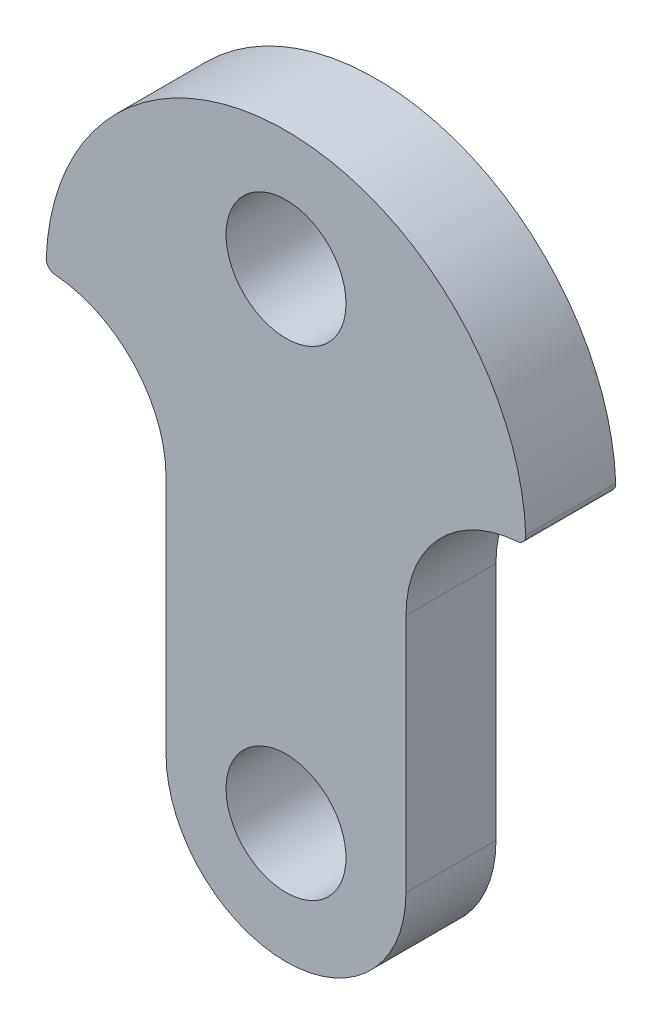
ISO-10303-21;
HEADER;
FILE_DESCRIPTION(('STEP AP214'),'2;1');
FILE_NAME('part.step','',(''),(''),'','','');
FILE_SCHEMA(('AUTOMOTIVE_DESIGN { 1 0 10303 214 1 1 1 1 }'));
ENDSEC;
DATA;
#1=APPLICATION_CONTEXT('core data for automotive mechanical design processes');
#2=APPLICATION_PROTOCOL_DEFINITION('international standard','automotive_design',2000,#1);
#3=PRODUCT_CONTEXT('',#1,'mechanical');
#4=PRODUCT('Part','Part','',(#3));
#5=PRODUCT_RELATED_PRODUCT_CATEGORY('part','',(#4));
#6=PRODUCT_DEFINITION_FORMATION('','',#4);
#7=PRODUCT_DEFINITION_CONTEXT('part definition',#1,'design');
#8=PRODUCT_DEFINITION('design','',#6,#7);
#9=PRODUCT_DEFINITION_SHAPE('','',#8);
#10=(LENGTH_UNIT() NAMED_UNIT(*) SI_UNIT(.MILLI.,.METRE.));
#11=(NAMED_UNIT(*) PLANE_ANGLE_UNIT() SI_UNIT($,.RADIAN.));
#12=(NAMED_UNIT(*) SI_UNIT($,.STERADIAN.) SOLID_ANGLE_UNIT());
#13=UNCERTAINTY_MEASURE_WITH_UNIT(LENGTH_MEASURE(1.E-05),#10,'distance_accuracy_value','');
#14=(GEOMETRIC_REPRESENTATION_CONTEXT(3) GLOBAL_UNCERTAINTY_ASSIGNED_CONTEXT((#13)) GLOBAL_UNIT_ASSIGNED_CONTEXT((#10,
#11,#12)) REPRESENTATION_CONTEXT('',''));
#15=CARTESIAN_POINT('',(0.,0.,0.));
#16=DIRECTION('',(0.,0.,1.));
#17=DIRECTION('',(1.,0.,0.));
#18=AXIS2_PLACEMENT_3D('',#15,#16,#17);
#19=CARTESIAN_POINT('',(25.4,-38.1,9.525));
#20=DIRECTION('',(0.,0.,-1.));
#21=DIRECTION('',(-1.,0.,0.));
#22=AXIS2_PLACEMENT_3D('',#19,#20,#21);
#23=PLANE('',#22);
#24=CARTESIAN_POINT('',(25.4,12.7,9.525));
#25=DIRECTION('',(0.,0.,1.));
#26=DIRECTION('',(1.,0.,0.));
#27=AXIS2_PLACEMENT_3D('',#24,#25,#26);
#28=CIRCLE('',#27,6.35);
#29=CARTESIAN_POINT('',(31.75,12.7,9.525));
#30=VERTEX_POINT('',#29);
#31=EDGE_CURVE('E293',#30,#30,#28,.T.);
#32=ORIENTED_EDGE('',*,*,#31,.F.);
#33=EDGE_LOOP('',(#32));
#34=FACE_BOUND('',#33,.T.);
#35=CARTESIAN_POINT('',(50.8,-12.7,9.525));
#36=DIRECTION('',(0.,0.,-1.));
#37=DIRECTION('',(-1.,0.,0.));
#38=AXIS2_PLACEMENT_3D('',#35,#36,#37);
#39=CIRCLE('',#38,12.7);
#40=CARTESIAN_POINT('',(38.1,-12.7,9.525));
#41=VERTEX_POINT('',#40);
#42=CARTESIAN_POINT('',(49.8554041423883,-0.0351771166832802,9.525));
#43=VERTEX_POINT('',#42);
#44=EDGE_CURVE('E140',#41,#43,#39,.T.);
#45=ORIENTED_EDGE('',*,*,#44,.T.);
#46=CARTESIAN_POINT('',(49.7810265158047,0.962053031609374,9.525));
#47=DIRECTION('',(0.,0.,-1.));
#48=DIRECTION('',(-1.,0.,0.));
#49=AXIS2_PLACEMENT_3D('',#46,#47,#48);
#50=CIRCLE('',#49,1.);
#51=CARTESIAN_POINT('',(50.7802489139934,1.00148143454418,9.525));
#52=VERTEX_POINT('',#51);
#53=EDGE_CURVE('E45',#43,#52,#50,.F.);
#54=ORIENTED_EDGE('',*,*,#53,.T.);
#55=CARTESIAN_POINT('',(25.4,0.,9.525));
#56=DIRECTION('',(0.,0.,1.));
#57=DIRECTION('',(1.,0.,0.));
#58=AXIS2_PLACEMENT_3D('',#55,#56,#57);
#59=CIRCLE('',#58,25.4);
#60=CARTESIAN_POINT('',(0.0197510860065961,1.00148143454418,9.525));
#61=VERTEX_POINT('',#60);
#62=EDGE_CURVE('E133',#52,#61,#59,.T.);
#63=ORIENTED_EDGE('',*,*,#62,.T.);
#64=CARTESIAN_POINT('',(1.01897348419532,0.962053031609374,9.525));
#65=DIRECTION('',(0.,0.,-1.));
#66=DIRECTION('',(-1.,0.,0.));
#67=AXIS2_PLACEMENT_3D('',#64,#65,#66);
#68=CIRCLE('',#67,1.);
#69=CARTESIAN_POINT('',(0.944595857611716,-0.0351771166832802,9.525));
#70=VERTEX_POINT('',#69);
#71=EDGE_CURVE('E52',#61,#70,#68,.F.);
#72=ORIENTED_EDGE('',*,*,#71,.T.);
#73=CARTESIAN_POINT('',(0.,-12.7,9.525));
#74=DIRECTION('',(0.,0.,-1.));
#75=DIRECTION('',(-1.,0.,0.));
#76=AXIS2_PLACEMENT_3D('',#73,#74,#75);
#77=CIRCLE('',#76,12.7);
#78=CARTESIAN_POINT('',(12.7,-12.7,9.525));
#79=VERTEX_POINT('',#78);
#80=EDGE_CURVE('E109',#70,#79,#77,.T.);
#81=ORIENTED_EDGE('',*,*,#80,.T.);
#82=DIRECTION('',(0.,-1.,0.));
#83=VECTOR('',#82,1.);
#84=CARTESIAN_POINT('',(12.7,0.,9.525));
#85=LINE('',#84,#83);
#86=CARTESIAN_POINT('',(12.7,-38.1,9.525));
#87=VERTEX_POINT('',#86);
#88=EDGE_CURVE('E103',#79,#87,#85,.T.);
#89=ORIENTED_EDGE('',*,*,#88,.T.);
#90=CARTESIAN_POINT('',(25.4,-38.1,9.525));
#91=DIRECTION('',(0.,0.,1.));
#92=DIRECTION('',(-1.,0.,0.));
#93=AXIS2_PLACEMENT_3D('',#90,#91,#92);
#94=CIRCLE('',#93,12.7);
#95=CARTESIAN_POINT('',(38.1,-38.1,9.525));
#96=VERTEX_POINT('',#95);
#97=EDGE_CURVE('E107',#87,#96,#94,.T.);
#98=ORIENTED_EDGE('',*,*,#97,.T.);
#99=DIRECTION('',(0.,1.,0.));
#100=VECTOR('',#99,1.);
#101=CARTESIAN_POINT('',(38.1,-38.1,9.525));
#102=LINE('',#101,#100);
#103=EDGE_CURVE('E123',#96,#41,#102,.T.);
#104=ORIENTED_EDGE('',*,*,#103,.T.);
#105=EDGE_LOOP('',(#45,#54,#63,#72,#81,#89,#98,#104));
#106=FACE_BOUND('',#105,.T.);
#107=CARTESIAN_POINT('',(25.4,-38.1,9.525));
#108=DIRECTION('',(0.,0.,1.));
#109=DIRECTION('',(1.,0.,0.));
#110=AXIS2_PLACEMENT_3D('',#107,#108,#109);
#111=CIRCLE('',#110,6.35);
#112=CARTESIAN_POINT('',(19.05,-38.1,9.525));
#113=VERTEX_POINT('',#112);
#114=EDGE_CURVE('E181',#113,#113,#111,.T.);
#115=ORIENTED_EDGE('',*,*,#114,.F.);
#116=EDGE_LOOP('',(#115));
#117=FACE_BOUND('',#116,.T.);
#118=ADVANCED_FACE('F37',(#34,#106,#117),#23,.F.);
#119=CARTESIAN_POINT('',(25.4,-38.1,0.));
#120=DIRECTION('',(0.,0.,-1.));
#121=DIRECTION('',(-1.,0.,0.));
#122=AXIS2_PLACEMENT_3D('',#119,#120,#121);
#123=PLANE('',#122);
#124=CARTESIAN_POINT('',(25.4,12.7,0.));
#125=DIRECTION('',(0.,0.,1.));
#126=DIRECTION('',(1.,0.,0.));
#127=AXIS2_PLACEMENT_3D('',#124,#125,#126);
#128=CIRCLE('',#127,6.35);
#129=CARTESIAN_POINT('',(31.75,12.7,0.));
#130=VERTEX_POINT('',#129);
#131=EDGE_CURVE('E291',#130,#130,#128,.T.);
#132=ORIENTED_EDGE('',*,*,#131,.T.);
#133=EDGE_LOOP('',(#132));
#134=FACE_BOUND('',#133,.T.);
#135=CARTESIAN_POINT('',(25.4,0.,0.));
#136=DIRECTION('',(0.,0.,1.));
#137=DIRECTION('',(1.,0.,0.));
#138=AXIS2_PLACEMENT_3D('',#135,#136,#137);
#139=CIRCLE('',#138,25.4);
#140=CARTESIAN_POINT('',(50.7802489139934,1.00148143454418,0.));
#141=VERTEX_POINT('',#140);
#142=CARTESIAN_POINT('',(0.0197510860065961,1.00148143454418,0.));
#143=VERTEX_POINT('',#142);
#144=EDGE_CURVE('E114',#141,#143,#139,.T.);
#145=ORIENTED_EDGE('',*,*,#144,.F.);
#146=CARTESIAN_POINT('',(49.7810265158047,0.962053031609374,0.));
#147=DIRECTION('',(0.,0.,-1.));
#148=DIRECTION('',(-1.,0.,0.));
#149=AXIS2_PLACEMENT_3D('',#146,#147,#148);
#150=CIRCLE('',#149,1.);
#151=CARTESIAN_POINT('',(49.8554041423883,-0.0351771166832802,0.));
#152=VERTEX_POINT('',#151);
#153=EDGE_CURVE('E153',#141,#152,#150,.T.);
#154=ORIENTED_EDGE('',*,*,#153,.T.);
#155=CARTESIAN_POINT('',(50.8,-12.7,0.));
#156=DIRECTION('',(0.,0.,-1.));
#157=DIRECTION('',(-1.,0.,0.));
#158=AXIS2_PLACEMENT_3D('',#155,#156,#157);
#159=CIRCLE('',#158,12.7);
#160=CARTESIAN_POINT('',(38.1,-12.7,0.));
#161=VERTEX_POINT('',#160);
#162=EDGE_CURVE('E138',#152,#161,#159,.F.);
#163=ORIENTED_EDGE('',*,*,#162,.T.);
#164=DIRECTION('',(0.,1.,0.));
#165=VECTOR('',#164,1.);
#166=CARTESIAN_POINT('',(38.1,-38.1,0.));
#167=LINE('',#166,#165);
#168=CARTESIAN_POINT('',(38.1,-38.1,0.));
#169=VERTEX_POINT('',#168);
#170=EDGE_CURVE('E176',#169,#161,#167,.T.);
#171=ORIENTED_EDGE('',*,*,#170,.F.);
#172=CARTESIAN_POINT('',(25.4,-38.1,0.));
#173=DIRECTION('',(0.,0.,1.));
#174=DIRECTION('',(-1.,0.,0.));
#175=AXIS2_PLACEMENT_3D('',#172,#173,#174);
#176=CIRCLE('',#175,12.7);
#177=CARTESIAN_POINT('',(12.7,-38.1,0.));
#178=VERTEX_POINT('',#177);
#179=EDGE_CURVE('E180',#178,#169,#176,.T.);
#180=ORIENTED_EDGE('',*,*,#179,.F.);
#181=DIRECTION('',(0.,-1.,0.));
#182=VECTOR('',#181,1.);
#183=CARTESIAN_POINT('',(12.7,0.,0.));
#184=LINE('',#183,#182);
#185=CARTESIAN_POINT('',(12.7,-12.7,0.));
#186=VERTEX_POINT('',#185);
#187=EDGE_CURVE('E127',#186,#178,#184,.T.);
#188=ORIENTED_EDGE('',*,*,#187,.F.);
#189=CARTESIAN_POINT('',(0.,-12.7,0.));
#190=DIRECTION('',(0.,0.,-1.));
#191=DIRECTION('',(-1.,0.,0.));
#192=AXIS2_PLACEMENT_3D('',#189,#190,#191);
#193=CIRCLE('',#192,12.7);
#194=CARTESIAN_POINT('',(0.944595857611716,-0.0351771166832802,0.));
#195=VERTEX_POINT('',#194);
#196=EDGE_CURVE('E142',#186,#195,#193,.F.);
#197=ORIENTED_EDGE('',*,*,#196,.T.);
#198=CARTESIAN_POINT('',(1.01897348419532,0.962053031609374,0.));
#199=DIRECTION('',(0.,0.,-1.));
#200=DIRECTION('',(-1.,0.,0.));
#201=AXIS2_PLACEMENT_3D('',#198,#199,#200);
#202=CIRCLE('',#201,1.);
#203=EDGE_CURVE('E151',#195,#143,#202,.T.);
#204=ORIENTED_EDGE('',*,*,#203,.T.);
#205=EDGE_LOOP('',(#145,#154,#163,#171,#180,#188,#197,#204));
#206=FACE_BOUND('',#205,.T.);
#207=CARTESIAN_POINT('',(25.4,-38.1,0.));
#208=DIRECTION('',(0.,0.,1.));
#209=DIRECTION('',(1.,0.,0.));
#210=AXIS2_PLACEMENT_3D('',#207,#208,#209);
#211=CIRCLE('',#210,6.35);
#212=CARTESIAN_POINT('',(19.05,-38.1,0.));
#213=VERTEX_POINT('',#212);
#214=EDGE_CURVE('E295',#213,#213,#211,.T.);
#215=ORIENTED_EDGE('',*,*,#214,.T.);
#216=EDGE_LOOP('',(#215));
#217=FACE_BOUND('',#216,.T.);
#218=ADVANCED_FACE('F168',(#134,#206,#217),#123,.T.);
#219=CARTESIAN_POINT('',(12.7,0.,9.525));
#220=DIRECTION('',(1.,0.,0.));
#221=DIRECTION('',(0.,0.,-1.));
#222=AXIS2_PLACEMENT_3D('',#219,#220,#221);
#223=PLANE('',#222);
#224=ORIENTED_EDGE('',*,*,#88,.F.);
#225=DIRECTION('',(0.,0.,-1.));
#226=VECTOR('',#225,1.);
#227=CARTESIAN_POINT('',(12.7,-12.7,0.));
#228=LINE('',#227,#226);
#229=EDGE_CURVE('E131',#79,#186,#228,.T.);
#230=ORIENTED_EDGE('',*,*,#229,.T.);
#231=ORIENTED_EDGE('',*,*,#187,.T.);
#232=DIRECTION('',(0.,0.,-1.));
#233=VECTOR('',#232,1.);
#234=CARTESIAN_POINT('',(12.7,-38.1,9.525));
#235=LINE('',#234,#233);
#236=EDGE_CURVE('E119',#87,#178,#235,.T.);
#237=ORIENTED_EDGE('',*,*,#236,.F.);
#238=EDGE_LOOP('',(#224,#230,#231,#237));
#239=FACE_BOUND('',#238,.T.);
#240=ADVANCED_FACE('F125',(#239),#223,.F.);
#241=CARTESIAN_POINT('',(25.4,-38.1,9.525));
#242=DIRECTION('',(0.,0.,-1.));
#243=DIRECTION('',(-1.,0.,0.));
#244=AXIS2_PLACEMENT_3D('',#241,#242,#243);
#245=CYLINDRICAL_SURFACE('',#244,12.7);
#246=ORIENTED_EDGE('',*,*,#179,.T.);
#247=DIRECTION('',(0.,0.,-1.));
#248=VECTOR('',#247,1.);
#249=CARTESIAN_POINT('',(38.1,-38.1,9.525));
#250=LINE('',#249,#248);
#251=EDGE_CURVE('E121',#96,#169,#250,.T.);
#252=ORIENTED_EDGE('',*,*,#251,.F.);
#253=ORIENTED_EDGE('',*,*,#97,.F.);
#254=ORIENTED_EDGE('',*,*,#236,.T.);
#255=EDGE_LOOP('',(#246,#252,#253,#254));
#256=FACE_BOUND('',#255,.T.);
#257=ADVANCED_FACE('F118',(#256),#245,.T.);
#258=CARTESIAN_POINT('',(38.1,-38.1,9.525));
#259=DIRECTION('',(-1.,0.,0.));
#260=DIRECTION('',(0.,0.,1.));
#261=AXIS2_PLACEMENT_3D('',#258,#259,#260);
#262=PLANE('',#261);
#263=ORIENTED_EDGE('',*,*,#170,.T.);
#264=DIRECTION('',(0.,0.,-1.));
#265=VECTOR('',#264,1.);
#266=CARTESIAN_POINT('',(38.1,-12.7,9.525));
#267=LINE('',#266,#265);
#268=EDGE_CURVE('E129',#161,#41,#267,.F.);
#269=ORIENTED_EDGE('',*,*,#268,.T.);
#270=ORIENTED_EDGE('',*,*,#103,.F.);
#271=ORIENTED_EDGE('',*,*,#251,.T.);
#272=EDGE_LOOP('',(#263,#269,#270,#271));
#273=FACE_BOUND('',#272,.T.);
#274=ADVANCED_FACE('F175',(#273),#262,.F.);
#275=CARTESIAN_POINT('',(25.4,0.,9.525));
#276=DIRECTION('',(0.,0.,-1.));
#277=DIRECTION('',(-1.,0.,0.));
#278=AXIS2_PLACEMENT_3D('',#275,#276,#277);
#279=CYLINDRICAL_SURFACE('',#278,25.4);
#280=ORIENTED_EDGE('',*,*,#62,.F.);
#281=DIRECTION('',(0.,0.,-1.));
#282=VECTOR('',#281,1.);
#283=CARTESIAN_POINT('',(50.7802489139934,1.00148143454418,9.525));
#284=LINE('',#283,#282);
#285=EDGE_CURVE('E148',#52,#141,#284,.T.);
#286=ORIENTED_EDGE('',*,*,#285,.T.);
#287=ORIENTED_EDGE('',*,*,#144,.T.);
#288=DIRECTION('',(0.,0.,-1.));
#289=VECTOR('',#288,1.);
#290=CARTESIAN_POINT('',(0.0197510860065996,1.00148143454418,9.525));
#291=LINE('',#290,#289);
#292=EDGE_CURVE('E146',#143,#61,#291,.F.);
#293=ORIENTED_EDGE('',*,*,#292,.T.);
#294=EDGE_LOOP('',(#280,#286,#287,#293));
#295=FACE_BOUND('',#294,.T.);
#296=ADVANCED_FACE('F161',(#295),#279,.T.);
#297=CARTESIAN_POINT('',(25.4,-38.1,9.525));
#298=DIRECTION('',(0.,0.,-1.));
#299=DIRECTION('',(-1.,0.,0.));
#300=AXIS2_PLACEMENT_3D('',#297,#298,#299);
#301=CYLINDRICAL_SURFACE('',#300,6.35);
#302=CARTESIAN_POINT('',(19.05,-38.1,9.525));
#303=CARTESIAN_POINT('',(19.05,-38.1,9.42578125));
#304=CARTESIAN_POINT('',(19.05,-38.1,9.3265625));
#305=CARTESIAN_POINT('',(19.05,-38.1,9.128125));
#306=CARTESIAN_POINT('',(19.05,-38.1,9.02890625));
#307=CARTESIAN_POINT('',(19.05,-38.1,8.83046875));
#308=CARTESIAN_POINT('',(19.05,-38.1,8.73125));
#309=CARTESIAN_POINT('',(19.05,-38.1,8.5328125));
#310=CARTESIAN_POINT('',(19.05,-38.1,8.43359375));
#311=CARTESIAN_POINT('',(19.05,-38.1,8.23515625));
#312=CARTESIAN_POINT('',(19.05,-38.1,8.1359375));
#313=CARTESIAN_POINT('',(19.05,-38.1,7.9375));
#314=CARTESIAN_POINT('',(19.05,-38.1,7.83828125));
#315=CARTESIAN_POINT('',(19.05,-38.1,7.63984375));
#316=CARTESIAN_POINT('',(19.05,-38.1,7.540625));
#317=CARTESIAN_POINT('',(19.05,-38.1,7.3421875));
#318=CARTESIAN_POINT('',(19.05,-38.1,7.24296875));
#319=CARTESIAN_POINT('',(19.05,-38.1,7.04453125));
#320=CARTESIAN_POINT('',(19.05,-38.1,6.9453125));
#321=CARTESIAN_POINT('',(19.05,-38.1,6.746875));
#322=CARTESIAN_POINT('',(19.05,-38.1,6.64765625));
#323=CARTESIAN_POINT('',(19.05,-38.1,6.44921875));
#324=CARTESIAN_POINT('',(19.05,-38.1,6.35));
#325=CARTESIAN_POINT('',(19.05,-38.1,6.1515625));
#326=CARTESIAN_POINT('',(19.05,-38.1,6.05234375));
#327=CARTESIAN_POINT('',(19.05,-38.1,5.85390625));
#328=CARTESIAN_POINT('',(19.05,-38.1,5.7546875));
#329=CARTESIAN_POINT('',(19.05,-38.1,5.55625));
#330=CARTESIAN_POINT('',(19.05,-38.1,5.45703125));
#331=CARTESIAN_POINT('',(19.05,-38.1,5.25859375));
#332=CARTESIAN_POINT('',(19.05,-38.1,5.159375));
#333=CARTESIAN_POINT('',(19.05,-38.1,4.9609375));
#334=CARTESIAN_POINT('',(19.05,-38.1,4.86171875));
#335=CARTESIAN_POINT('',(19.05,-38.1,4.66328125));
#336=CARTESIAN_POINT('',(19.05,-38.1,4.5640625));
#337=CARTESIAN_POINT('',(19.05,-38.1,4.365625));
#338=CARTESIAN_POINT('',(19.05,-38.1,4.26640625));
#339=CARTESIAN_POINT('',(19.05,-38.1,4.06796875));
#340=CARTESIAN_POINT('',(19.05,-38.1,3.96875));
#341=CARTESIAN_POINT('',(19.05,-38.1,3.7703125));
#342=CARTESIAN_POINT('',(19.05,-38.1,3.67109375));
#343=CARTESIAN_POINT('',(19.05,-38.1,3.47265625));
#344=CARTESIAN_POINT('',(19.05,-38.1,3.3734375));
#345=CARTESIAN_POINT('',(19.05,-38.1,3.175));
#346=CARTESIAN_POINT('',(19.05,-38.1,3.07578125));
#347=CARTESIAN_POINT('',(19.05,-38.1,2.87734375));
#348=CARTESIAN_POINT('',(19.05,-38.1,2.778125));
#349=CARTESIAN_POINT('',(19.05,-38.1,2.5796875));
#350=CARTESIAN_POINT('',(19.05,-38.1,2.48046875));
#351=CARTESIAN_POINT('',(19.05,-38.1,2.28203125));
#352=CARTESIAN_POINT('',(19.05,-38.1,2.1828125));
#353=CARTESIAN_POINT('',(19.05,-38.1,1.984375));
#354=CARTESIAN_POINT('',(19.05,-38.1,1.88515625));
#355=CARTESIAN_POINT('',(19.05,-38.1,1.68671875));
#356=CARTESIAN_POINT('',(19.05,-38.1,1.5875));
#357=CARTESIAN_POINT('',(19.05,-38.1,1.3890625));
#358=CARTESIAN_POINT('',(19.05,-38.1,1.28984375));
#359=CARTESIAN_POINT('',(19.05,-38.1,1.09140625));
#360=CARTESIAN_POINT('',(19.05,-38.1,0.992187500000001));
#361=CARTESIAN_POINT('',(19.05,-38.1,0.793750000000001));
#362=CARTESIAN_POINT('',(19.05,-38.1,0.69453125));
#363=CARTESIAN_POINT('',(19.05,-38.1,0.49609375));
#364=CARTESIAN_POINT('',(19.05,-38.1,0.396875));
#365=CARTESIAN_POINT('',(19.05,-38.1,0.1984375));
#366=CARTESIAN_POINT('',(19.05,-38.1,0.0992187500000001));
#367=CARTESIAN_POINT('',(19.05,-38.1,0.));
#368=B_SPLINE_CURVE_WITH_KNOTS('',3,(#302,#303,#304,#305,#306,#307,#308,#309,#310,#311,#312,
#313,#314,#315,#316,#317,#318,#319,#320,#321,#322,#323,#324,#325,#326,#327,#328,#329,#330,#331,
#332,#333,#334,#335,#336,#337,#338,#339,#340,#341,#342,#343,#344,#345,#346,#347,#348,#349,#350,
#351,#352,#353,#354,#355,#356,#357,#358,#359,#360,#361,#362,#363,#364,#365,#366,#367),
.UNSPECIFIED.,.F.,.F.,(4,2,2,2,2,2,2,2,2,2,2,2,2,2,2,2,2,2,2,2,2,2,2,2,2,2,2,2,2,2,2,2,4),(0.,
0.297656249999998,0.595312499999999,0.892968749999999,1.190625,1.48828125,1.7859375,2.08359375,
2.38125,2.67890625,2.9765625,3.27421875,3.571875,3.86953125,4.1671875,4.46484375,4.7625,
5.06015625,5.3578125,5.65546875,5.953125,6.25078125,6.5484375,6.84609375,7.14375,7.44140625,
7.7390625,8.03671875,8.334375,8.63203125,8.9296875,9.22734375,9.525),.UNSPECIFIED.);
#369=EDGE_CURVE('BSEAM205',#113,#213,#368,.T.);
#370=ORIENTED_EDGE('',*,*,#114,.T.);
#371=ORIENTED_EDGE('',*,*,#214,.F.);
#372=ORIENTED_EDGE('',*,*,#369,.T.);
#373=ORIENTED_EDGE('',*,*,#369,.F.);
#374=EDGE_LOOP('',(#370,#372,#371,#373));
#375=FACE_BOUND('',#374,.T.);
#376=ADVANCED_FACE('F205',(#375),#301,.F.);
#377=CARTESIAN_POINT('',(25.4,12.7,0.));
#378=DIRECTION('',(0.,0.,1.));
#379=DIRECTION('',(1.,0.,0.));
#380=AXIS2_PLACEMENT_3D('',#377,#378,#379);
#381=CYLINDRICAL_SURFACE('',#380,6.35);
#382=CARTESIAN_POINT('',(31.75,12.7,0.));
#383=CARTESIAN_POINT('',(31.75,12.7,0.0992187499999999));
#384=CARTESIAN_POINT('',(31.75,12.7,0.1984375));
#385=CARTESIAN_POINT('',(31.75,12.7,0.396875));
#386=CARTESIAN_POINT('',(31.75,12.7,0.49609375));
#387=CARTESIAN_POINT('',(31.75,12.7,0.69453125));
#388=CARTESIAN_POINT('',(31.75,12.7,0.79375));
#389=CARTESIAN_POINT('',(31.75,12.7,0.9921875));
#390=CARTESIAN_POINT('',(31.75,12.7,1.09140625));
#391=CARTESIAN_POINT('',(31.75,12.7,1.28984375));
#392=CARTESIAN_POINT('',(31.75,12.7,1.3890625));
#393=CARTESIAN_POINT('',(31.75,12.7,1.5875));
#394=CARTESIAN_POINT('',(31.75,12.7,1.68671875));
#395=CARTESIAN_POINT('',(31.75,12.7,1.88515625));
#396=CARTESIAN_POINT('',(31.75,12.7,1.984375));
#397=CARTESIAN_POINT('',(31.75,12.7,2.1828125));
#398=CARTESIAN_POINT('',(31.75,12.7,2.28203125));
#399=CARTESIAN_POINT('',(31.75,12.7,2.48046875));
#400=CARTESIAN_POINT('',(31.75,12.7,2.5796875));
#401=CARTESIAN_POINT('',(31.75,12.7,2.778125));
#402=CARTESIAN_POINT('',(31.75,12.7,2.87734375));
#403=CARTESIAN_POINT('',(31.75,12.7,3.07578125));
#404=CARTESIAN_POINT('',(31.75,12.7,3.175));
#405=CARTESIAN_POINT('',(31.75,12.7,3.3734375));
#406=CARTESIAN_POINT('',(31.75,12.7,3.47265625));
#407=CARTESIAN_POINT('',(31.75,12.7,3.67109375));
#408=CARTESIAN_POINT('',(31.75,12.7,3.7703125));
#409=CARTESIAN_POINT('',(31.75,12.7,3.96875));
#410=CARTESIAN_POINT('',(31.75,12.7,4.06796875));
#411=CARTESIAN_POINT('',(31.75,12.7,4.26640625));
#412=CARTESIAN_POINT('',(31.75,12.7,4.365625));
#413=CARTESIAN_POINT('',(31.75,12.7,4.5640625));
#414=CARTESIAN_POINT('',(31.75,12.7,4.66328125));
#415=CARTESIAN_POINT('',(31.75,12.7,4.86171875));
#416=CARTESIAN_POINT('',(31.75,12.7,4.9609375));
#417=CARTESIAN_POINT('',(31.75,12.7,5.159375));
#418=CARTESIAN_POINT('',(31.75,12.7,5.25859375));
#419=CARTESIAN_POINT('',(31.75,12.7,5.45703125));
#420=CARTESIAN_POINT('',(31.75,12.7,5.55625));
#421=CARTESIAN_POINT('',(31.75,12.7,5.7546875));
#422=CARTESIAN_POINT('',(31.75,12.7,5.85390625));
#423=CARTESIAN_POINT('',(31.75,12.7,6.05234375));
#424=CARTESIAN_POINT('',(31.75,12.7,6.1515625));
#425=CARTESIAN_POINT('',(31.75,12.7,6.35));
#426=CARTESIAN_POINT('',(31.75,12.7,6.44921875));
#427=CARTESIAN_POINT('',(31.75,12.7,6.64765625));
#428=CARTESIAN_POINT('',(31.75,12.7,6.746875));
#429=CARTESIAN_POINT('',(31.75,12.7,6.9453125));
#430=CARTESIAN_POINT('',(31.75,12.7,7.04453125));
#431=CARTESIAN_POINT('',(31.75,12.7,7.24296875));
#432=CARTESIAN_POINT('',(31.75,12.7,7.3421875));
#433=CARTESIAN_POINT('',(31.75,12.7,7.540625));
#434=CARTESIAN_POINT('',(31.75,12.7,7.63984375));
#435=CARTESIAN_POINT('',(31.75,12.7,7.83828125));
#436=CARTESIAN_POINT('',(31.75,12.7,7.9375));
#437=CARTESIAN_POINT('',(31.75,12.7,8.1359375));
#438=CARTESIAN_POINT('',(31.75,12.7,8.23515625));
#439=CARTESIAN_POINT('',(31.75,12.7,8.43359375));
#440=CARTESIAN_POINT('',(31.75,12.7,8.5328125));
#441=CARTESIAN_POINT('',(31.75,12.7,8.73125));
#442=CARTESIAN_POINT('',(31.75,12.7,8.83046875));
#443=CARTESIAN_POINT('',(31.75,12.7,9.02890625));
#444=CARTESIAN_POINT('',(31.75,12.7,9.128125));
#445=CARTESIAN_POINT('',(31.75,12.7,9.3265625));
#446=CARTESIAN_POINT('',(31.75,12.7,9.42578125));
#447=CARTESIAN_POINT('',(31.75,12.7,9.525));
#448=B_SPLINE_CURVE_WITH_KNOTS('',3,(#382,#383,#384,#385,#386,#387,#388,#389,#390,#391,#392,
#393,#394,#395,#396,#397,#398,#399,#400,#401,#402,#403,#404,#405,#406,#407,#408,#409,#410,#411,
#412,#413,#414,#415,#416,#417,#418,#419,#420,#421,#422,#423,#424,#425,#426,#427,#428,#429,#430,
#431,#432,#433,#434,#435,#436,#437,#438,#439,#440,#441,#442,#443,#444,#445,#446,#447),
.UNSPECIFIED.,.F.,.F.,(4,2,2,2,2,2,2,2,2,2,2,2,2,2,2,2,2,2,2,2,2,2,2,2,2,2,2,2,2,2,2,2,4),(0.,
0.29765625,0.5953125,0.89296875,1.190625,1.48828125,1.7859375,2.08359375,2.38125,2.67890625,
2.9765625,3.27421875,3.571875,3.86953125,4.1671875,4.46484375,4.7625,5.06015625,5.3578125,
5.65546875,5.953125,6.25078125,6.5484375,6.84609375,7.14375,7.44140625,7.7390625,8.03671875,
8.334375,8.63203125,8.9296875,9.22734375,9.525),.UNSPECIFIED.);
#449=EDGE_CURVE('BSEAM193',#130,#30,#448,.T.);
#450=ORIENTED_EDGE('',*,*,#131,.F.);
#451=ORIENTED_EDGE('',*,*,#31,.T.);
#452=ORIENTED_EDGE('',*,*,#449,.T.);
#453=ORIENTED_EDGE('',*,*,#449,.F.);
#454=EDGE_LOOP('',(#450,#452,#451,#453));
#455=FACE_BOUND('',#454,.T.);
#456=ADVANCED_FACE('F193',(#455),#381,.F.);
#457=CARTESIAN_POINT('',(50.8,-12.7,9.525));
#458=DIRECTION('',(0.,0.,1.));
#459=DIRECTION('',(1.,0.,0.));
#460=AXIS2_PLACEMENT_3D('',#457,#458,#459);
#461=CYLINDRICAL_SURFACE('',#460,12.7);
#462=ORIENTED_EDGE('',*,*,#162,.F.);
#463=DIRECTION('',(0.,0.,1.));
#464=VECTOR('',#463,1.);
#465=CARTESIAN_POINT('',(49.8554041423883,-0.0351771166832784,9.525));
#466=LINE('',#465,#464);
#467=EDGE_CURVE('E60',#152,#43,#466,.T.);
#468=ORIENTED_EDGE('',*,*,#467,.T.);
#469=ORIENTED_EDGE('',*,*,#44,.F.);
#470=ORIENTED_EDGE('',*,*,#268,.F.);
#471=EDGE_LOOP('',(#462,#468,#469,#470));
#472=FACE_BOUND('',#471,.T.);
#473=ADVANCED_FACE('F173',(#472),#461,.F.);
#474=CARTESIAN_POINT('',(0.,-12.7,9.525));
#475=DIRECTION('',(0.,0.,1.));
#476=DIRECTION('',(1.,0.,0.));
#477=AXIS2_PLACEMENT_3D('',#474,#475,#476);
#478=CYLINDRICAL_SURFACE('',#477,12.7);
#479=ORIENTED_EDGE('',*,*,#80,.F.);
#480=DIRECTION('',(0.,0.,1.));
#481=VECTOR('',#480,1.);
#482=CARTESIAN_POINT('',(0.944595857611716,-0.0351771166832802,9.525));
#483=LINE('',#482,#481);
#484=EDGE_CURVE('E11',#70,#195,#483,.F.);
#485=ORIENTED_EDGE('',*,*,#484,.T.);
#486=ORIENTED_EDGE('',*,*,#196,.F.);
#487=ORIENTED_EDGE('',*,*,#229,.F.);
#488=EDGE_LOOP('',(#479,#485,#486,#487));
#489=FACE_BOUND('',#488,.T.);
#490=ADVANCED_FACE('F186',(#489),#478,.F.);
#491=CARTESIAN_POINT('',(49.7810265158047,0.962053031609374,9.525));
#492=DIRECTION('',(0.,0.,1.));
#493=DIRECTION('',(1.,0.,0.));
#494=AXIS2_PLACEMENT_3D('',#491,#492,#493);
#495=CYLINDRICAL_SURFACE('',#494,1.);
#496=ORIENTED_EDGE('',*,*,#53,.F.);
#497=ORIENTED_EDGE('',*,*,#467,.F.);
#498=ORIENTED_EDGE('',*,*,#153,.F.);
#499=ORIENTED_EDGE('',*,*,#285,.F.);
#500=EDGE_LOOP('',(#496,#497,#498,#499));
#501=FACE_BOUND('',#500,.T.);
#502=ADVANCED_FACE('F166',(#501),#495,.T.);
#503=CARTESIAN_POINT('',(1.01897348419532,0.962053031609374,9.525));
#504=DIRECTION('',(0.,0.,1.));
#505=DIRECTION('',(1.,0.,0.));
#506=AXIS2_PLACEMENT_3D('',#503,#504,#505);
#507=CYLINDRICAL_SURFACE('',#506,1.);
#508=ORIENTED_EDGE('',*,*,#71,.F.);
#509=ORIENTED_EDGE('',*,*,#292,.F.);
#510=ORIENTED_EDGE('',*,*,#203,.F.);
#511=ORIENTED_EDGE('',*,*,#484,.F.);
#512=EDGE_LOOP('',(#508,#509,#510,#511));
#513=FACE_BOUND('',#512,.T.);
#514=ADVANCED_FACE('F39',(#513),#507,.T.);
#515=CLOSED_SHELL('',(#118,#218,#240,#257,#274,#296,#376,#456,#473,#490,#502,#514));
#516=MANIFOLD_SOLID_BREP('B2',#515);
#517=ADVANCED_BREP_SHAPE_REPRESENTATION('',(#18,#516),#14);
#518=SHAPE_DEFINITION_REPRESENTATION(#9,#517);
ENDSEC;
END-ISO-10303-21;
